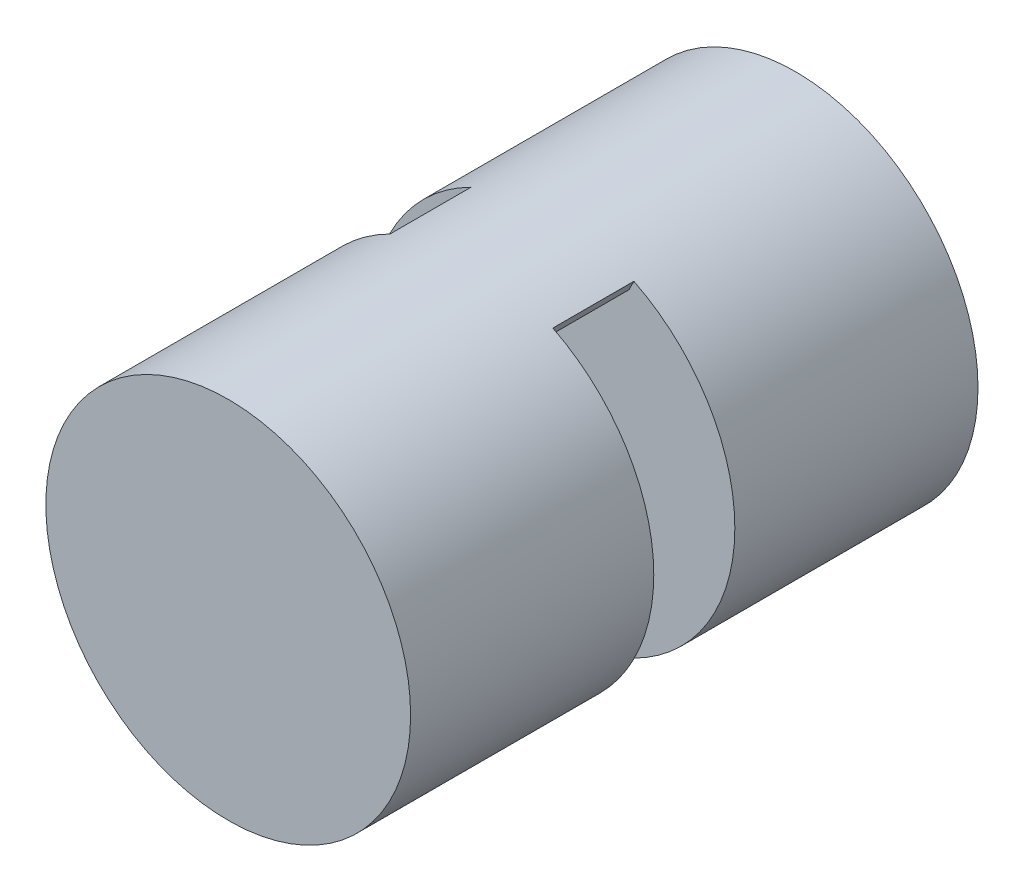
ISO-10303-21;
HEADER;
FILE_DESCRIPTION(('STEP AP214'),'2;1');
FILE_NAME('part.step','',(''),(''),'','','');
FILE_SCHEMA(('AUTOMOTIVE_DESIGN { 1 0 10303 214 1 1 1 1 }'));
ENDSEC;
DATA;
#1=APPLICATION_CONTEXT('core data for automotive mechanical design processes');
#2=APPLICATION_PROTOCOL_DEFINITION('international standard','automotive_design',2000,#1);
#3=PRODUCT_CONTEXT('',#1,'mechanical');
#4=PRODUCT('Part','Part','',(#3));
#5=PRODUCT_RELATED_PRODUCT_CATEGORY('part','',(#4));
#6=PRODUCT_DEFINITION_FORMATION('','',#4);
#7=PRODUCT_DEFINITION_CONTEXT('part definition',#1,'design');
#8=PRODUCT_DEFINITION('design','',#6,#7);
#9=PRODUCT_DEFINITION_SHAPE('','',#8);
#10=(LENGTH_UNIT() NAMED_UNIT(*) SI_UNIT(.MILLI.,.METRE.));
#11=(NAMED_UNIT(*) PLANE_ANGLE_UNIT() SI_UNIT($,.RADIAN.));
#12=(NAMED_UNIT(*) SI_UNIT($,.STERADIAN.) SOLID_ANGLE_UNIT());
#13=UNCERTAINTY_MEASURE_WITH_UNIT(LENGTH_MEASURE(1.E-05),#10,'distance_accuracy_value','');
#14=(GEOMETRIC_REPRESENTATION_CONTEXT(3) GLOBAL_UNCERTAINTY_ASSIGNED_CONTEXT((#13)) GLOBAL_UNIT_ASSIGNED_CONTEXT((#10,
#11,#12)) REPRESENTATION_CONTEXT('',''));
#15=CARTESIAN_POINT('',(0.,0.,0.));
#16=DIRECTION('',(0.,0.,1.));
#17=DIRECTION('',(1.,0.,0.));
#18=AXIS2_PLACEMENT_3D('',#15,#16,#17);
#19=CARTESIAN_POINT('',(0.,0.,30.));
#20=DIRECTION('',(0.,0.,1.));
#21=DIRECTION('',(1.,0.,0.));
#22=AXIS2_PLACEMENT_3D('',#19,#20,#21);
#23=PLANE('',#22);
#24=CARTESIAN_POINT('',(0.,0.,30.));
#25=DIRECTION('',(0.,0.,-1.));
#26=DIRECTION('',(1.,0.,0.));
#27=AXIS2_PLACEMENT_3D('',#24,#25,#26);
#28=CIRCLE('',#27,21.1536416609865);
#29=CARTESIAN_POINT('',(9.44725249039118,-18.9268585852016,30.));
#30=VERTEX_POINT('',#29);
#31=CARTESIAN_POINT('',(-9.44725249039115,-18.9268585852016,30.));
#32=VERTEX_POINT('',#31);
#33=EDGE_CURVE('E145',#30,#32,#28,.T.);
#34=ORIENTED_EDGE('',*,*,#33,.F.);
#35=DIRECTION('',(-0.446601707724618,0.894732873352407,0.));
#36=VECTOR('',#35,1.);
#37=CARTESIAN_POINT('',(10.0485384238039,-20.1314896504292,30.));
#38=LINE('',#37,#36);
#39=CARTESIAN_POINT('',(10.0485384238039,-20.1314896504292,30.));
#40=VERTEX_POINT('',#39);
#41=EDGE_CURVE('E132',#40,#30,#38,.T.);
#42=ORIENTED_EDGE('',*,*,#41,.F.);
#43=CARTESIAN_POINT('',(0.,0.,30.));
#44=DIRECTION('',(0.,0.,1.));
#45=DIRECTION('',(1.,0.,0.));
#46=AXIS2_PLACEMENT_3D('',#43,#44,#45);
#47=CIRCLE('',#46,22.5);
#48=CARTESIAN_POINT('',(10.0485384238039,20.1314896504292,30.));
#49=VERTEX_POINT('',#48);
#50=EDGE_CURVE('E47',#40,#49,#47,.T.);
#51=ORIENTED_EDGE('',*,*,#50,.T.);
#52=DIRECTION('',(0.446601707724617,0.894732873352408,0.));
#53=VECTOR('',#52,1.);
#54=CARTESIAN_POINT('',(10.0485384238039,20.1314896504292,30.));
#55=LINE('',#54,#53);
#56=CARTESIAN_POINT('',(9.44725249039119,18.9268585852016,30.));
#57=VERTEX_POINT('',#56);
#58=EDGE_CURVE('E62',#57,#49,#55,.T.);
#59=ORIENTED_EDGE('',*,*,#58,.F.);
#60=CARTESIAN_POINT('',(0.,0.,30.));
#61=DIRECTION('',(0.,0.,-1.));
#62=DIRECTION('',(1.,0.,0.));
#63=AXIS2_PLACEMENT_3D('',#60,#61,#62);
#64=CIRCLE('',#63,21.1536416609865);
#65=CARTESIAN_POINT('',(-9.44725249039119,18.9268585852016,30.));
#66=VERTEX_POINT('',#65);
#67=EDGE_CURVE('E162',#66,#57,#64,.T.);
#68=ORIENTED_EDGE('',*,*,#67,.F.);
#69=DIRECTION('',(0.446601707724618,-0.894732873352407,0.));
#70=VECTOR('',#69,1.);
#71=CARTESIAN_POINT('',(-10.0485384238039,20.1314896504292,30.));
#72=LINE('',#71,#70);
#73=CARTESIAN_POINT('',(-10.0485384238039,20.1314896504292,30.));
#74=VERTEX_POINT('',#73);
#75=EDGE_CURVE('E154',#74,#66,#72,.T.);
#76=ORIENTED_EDGE('',*,*,#75,.F.);
#77=CARTESIAN_POINT('',(-10.0485384238039,-20.1314896504292,30.));
#78=VERTEX_POINT('',#77);
#79=EDGE_CURVE('E12',#74,#78,#47,.T.);
#80=ORIENTED_EDGE('',*,*,#79,.T.);
#81=DIRECTION('',(-0.446601707724617,-0.894732873352408,0.));
#82=VECTOR('',#81,1.);
#83=CARTESIAN_POINT('',(-10.0485384238039,-20.1314896504292,30.));
#84=LINE('',#83,#82);
#85=EDGE_CURVE('E140',#32,#78,#84,.T.);
#86=ORIENTED_EDGE('',*,*,#85,.F.);
#87=EDGE_LOOP('',(#34,#42,#51,#59,#68,#76,#80,#86));
#88=FACE_BOUND('',#87,.T.);
#89=ADVANCED_FACE('F38',(#88),#23,.T.);
#90=CARTESIAN_POINT('',(0.,0.,30.));
#91=DIRECTION('',(0.,0.,-1.));
#92=DIRECTION('',(-1.,0.,0.));
#93=AXIS2_PLACEMENT_3D('',#90,#91,#92);
#94=CYLINDRICAL_SURFACE('',#93,22.5);
#95=DIRECTION('',(0.,0.,-1.));
#96=VECTOR('',#95,1.);
#97=CARTESIAN_POINT('',(-10.0485384238039,20.1314896504292,40.));
#98=LINE('',#97,#96);
#99=CARTESIAN_POINT('',(-10.0485384238039,20.1314896504292,40.));
#100=VERTEX_POINT('',#99);
#101=EDGE_CURVE('E105',#100,#74,#98,.T.);
#102=ORIENTED_EDGE('',*,*,#101,.F.);
#103=CARTESIAN_POINT('',(0.,0.,40.));
#104=DIRECTION('',(0.,0.,1.));
#105=DIRECTION('',(1.,0.,0.));
#106=AXIS2_PLACEMENT_3D('',#103,#104,#105);
#107=CIRCLE('',#106,22.5);
#108=CARTESIAN_POINT('',(-10.0485384238039,-20.1314896504292,40.));
#109=VERTEX_POINT('',#108);
#110=EDGE_CURVE('E110',#100,#109,#107,.T.);
#111=ORIENTED_EDGE('',*,*,#110,.T.);
#112=DIRECTION('',(0.,0.,-1.));
#113=VECTOR('',#112,1.);
#114=CARTESIAN_POINT('',(-10.0485384238039,-20.1314896504292,40.));
#115=LINE('',#114,#113);
#116=EDGE_CURVE('E143',#109,#78,#115,.T.);
#117=ORIENTED_EDGE('',*,*,#116,.T.);
#118=ORIENTED_EDGE('',*,*,#79,.F.);
#119=EDGE_LOOP('',(#102,#111,#117,#118));
#120=FACE_BOUND('',#119,.T.);
#121=CARTESIAN_POINT('',(10.0485384238039,-20.1314896504292,40.));
#122=VERTEX_POINT('',#121);
#123=CARTESIAN_POINT('',(10.0485384238039,20.1314896504292,40.));
#124=VERTEX_POINT('',#123);
#125=EDGE_CURVE('E129',#122,#124,#107,.T.);
#126=ORIENTED_EDGE('',*,*,#125,.T.);
#127=DIRECTION('',(0.,0.,-1.));
#128=VECTOR('',#127,1.);
#129=CARTESIAN_POINT('',(10.0485384238039,20.1314896504292,40.));
#130=LINE('',#129,#128);
#131=EDGE_CURVE('E160',#124,#49,#130,.T.);
#132=ORIENTED_EDGE('',*,*,#131,.T.);
#133=ORIENTED_EDGE('',*,*,#50,.F.);
#134=DIRECTION('',(0.,0.,-1.));
#135=VECTOR('',#134,1.);
#136=CARTESIAN_POINT('',(10.0485384238039,-20.1314896504292,40.));
#137=LINE('',#136,#135);
#138=EDGE_CURVE('E153',#122,#40,#137,.T.);
#139=ORIENTED_EDGE('',*,*,#138,.F.);
#140=EDGE_LOOP('',(#126,#132,#133,#139));
#141=FACE_BOUND('',#140,.T.);
#142=CARTESIAN_POINT('',(0.,0.,0.));
#143=DIRECTION('',(0.,0.,1.));
#144=DIRECTION('',(1.,0.,0.));
#145=AXIS2_PLACEMENT_3D('',#142,#143,#144);
#146=CIRCLE('',#145,22.5);
#147=CARTESIAN_POINT('',(22.5,0.,0.));
#148=VERTEX_POINT('',#147);
#149=EDGE_CURVE('E42',#148,#148,#146,.T.);
#150=ORIENTED_EDGE('',*,*,#149,.T.);
#151=EDGE_LOOP('',(#150));
#152=FACE_BOUND('',#151,.T.);
#153=CARTESIAN_POINT('',(0.,0.,70.));
#154=DIRECTION('',(0.,0.,1.));
#155=DIRECTION('',(1.,0.,0.));
#156=AXIS2_PLACEMENT_3D('',#153,#154,#155);
#157=CIRCLE('',#156,22.5);
#158=CARTESIAN_POINT('',(22.5,0.,70.));
#159=VERTEX_POINT('',#158);
#160=EDGE_CURVE('E128',#159,#159,#157,.T.);
#161=ORIENTED_EDGE('',*,*,#160,.F.);
#162=EDGE_LOOP('',(#161));
#163=FACE_BOUND('',#162,.T.);
#164=ADVANCED_FACE('F40',(#120,#141,#152,#163),#94,.T.);
#165=CARTESIAN_POINT('',(0.,0.,0.));
#166=DIRECTION('',(0.,0.,1.));
#167=DIRECTION('',(1.,0.,0.));
#168=AXIS2_PLACEMENT_3D('',#165,#166,#167);
#169=PLANE('',#168);
#170=ORIENTED_EDGE('',*,*,#149,.F.);
#171=EDGE_LOOP('',(#170));
#172=FACE_BOUND('',#171,.T.);
#173=ADVANCED_FACE('F201',(#172),#169,.F.);
#174=CARTESIAN_POINT('',(-10.0485384238039,20.1314896504292,40.));
#175=DIRECTION('',(0.894732873352408,0.446601707724618,0.));
#176=DIRECTION('',(-0.446601707724618,0.894732873352408,0.));
#177=AXIS2_PLACEMENT_3D('',#174,#175,#176);
#178=PLANE('',#177);
#179=ORIENTED_EDGE('',*,*,#75,.T.);
#180=DIRECTION('',(0.,0.,-1.));
#181=VECTOR('',#180,1.);
#182=CARTESIAN_POINT('',(-9.44725249039119,18.9268585852016,40.));
#183=LINE('',#182,#181);
#184=CARTESIAN_POINT('',(-9.44725249039119,18.9268585852016,40.));
#185=VERTEX_POINT('',#184);
#186=EDGE_CURVE('E113',#185,#66,#183,.T.);
#187=ORIENTED_EDGE('',*,*,#186,.F.);
#188=DIRECTION('',(0.446601707724618,-0.894732873352407,0.));
#189=VECTOR('',#188,1.);
#190=CARTESIAN_POINT('',(-10.0485384238039,20.1314896504292,40.));
#191=LINE('',#190,#189);
#192=EDGE_CURVE('E116',#100,#185,#191,.T.);
#193=ORIENTED_EDGE('',*,*,#192,.F.);
#194=ORIENTED_EDGE('',*,*,#101,.T.);
#195=EDGE_LOOP('',(#179,#187,#193,#194));
#196=FACE_BOUND('',#195,.T.);
#197=ADVANCED_FACE('F117',(#196),#178,.F.);
#198=CARTESIAN_POINT('',(0.,0.,40.));
#199=DIRECTION('',(0.,0.,-1.));
#200=DIRECTION('',(-1.,0.,0.));
#201=AXIS2_PLACEMENT_3D('',#198,#199,#200);
#202=CYLINDRICAL_SURFACE('',#201,21.1536416609865);
#203=ORIENTED_EDGE('',*,*,#67,.T.);
#204=DIRECTION('',(0.,0.,-1.));
#205=VECTOR('',#204,1.);
#206=CARTESIAN_POINT('',(9.44725249039119,18.9268585852016,40.));
#207=LINE('',#206,#205);
#208=CARTESIAN_POINT('',(9.44725249039119,18.9268585852016,40.));
#209=VERTEX_POINT('',#208);
#210=EDGE_CURVE('E167',#209,#57,#207,.T.);
#211=ORIENTED_EDGE('',*,*,#210,.F.);
#212=CARTESIAN_POINT('',(0.,0.,40.));
#213=DIRECTION('',(0.,0.,-1.));
#214=DIRECTION('',(1.,0.,0.));
#215=AXIS2_PLACEMENT_3D('',#212,#213,#214);
#216=CIRCLE('',#215,21.1536416609865);
#217=EDGE_CURVE('E122',#185,#209,#216,.T.);
#218=ORIENTED_EDGE('',*,*,#217,.F.);
#219=ORIENTED_EDGE('',*,*,#186,.T.);
#220=EDGE_LOOP('',(#203,#211,#218,#219));
#221=FACE_BOUND('',#220,.T.);
#222=ADVANCED_FACE('F171',(#221),#202,.F.);
#223=CARTESIAN_POINT('',(10.0485384238039,20.1314896504292,40.));
#224=DIRECTION('',(-0.894732873352408,0.446601707724617,0.));
#225=DIRECTION('',(-0.446601707724617,-0.894732873352408,0.));
#226=AXIS2_PLACEMENT_3D('',#223,#224,#225);
#227=PLANE('',#226);
#228=ORIENTED_EDGE('',*,*,#58,.T.);
#229=ORIENTED_EDGE('',*,*,#131,.F.);
#230=DIRECTION('',(0.446601707724617,0.894732873352408,0.));
#231=VECTOR('',#230,1.);
#232=CARTESIAN_POINT('',(10.0485384238039,20.1314896504292,40.));
#233=LINE('',#232,#231);
#234=EDGE_CURVE('E157',#209,#124,#233,.T.);
#235=ORIENTED_EDGE('',*,*,#234,.F.);
#236=ORIENTED_EDGE('',*,*,#210,.T.);
#237=EDGE_LOOP('',(#228,#229,#235,#236));
#238=FACE_BOUND('',#237,.T.);
#239=ADVANCED_FACE('F187',(#238),#227,.F.);
#240=CARTESIAN_POINT('',(10.0485384238039,-20.1314896504292,40.));
#241=DIRECTION('',(-0.894732873352408,-0.446601707724618,0.));
#242=DIRECTION('',(0.446601707724618,-0.894732873352408,0.));
#243=AXIS2_PLACEMENT_3D('',#240,#241,#242);
#244=PLANE('',#243);
#245=ORIENTED_EDGE('',*,*,#41,.T.);
#246=DIRECTION('',(0.,0.,-1.));
#247=VECTOR('',#246,1.);
#248=CARTESIAN_POINT('',(9.44725249039118,-18.9268585852016,40.));
#249=LINE('',#248,#247);
#250=CARTESIAN_POINT('',(9.44725249039118,-18.9268585852016,40.));
#251=VERTEX_POINT('',#250);
#252=EDGE_CURVE('E150',#251,#30,#249,.T.);
#253=ORIENTED_EDGE('',*,*,#252,.F.);
#254=DIRECTION('',(-0.446601707724618,0.894732873352407,0.));
#255=VECTOR('',#254,1.);
#256=CARTESIAN_POINT('',(10.0485384238039,-20.1314896504292,40.));
#257=LINE('',#256,#255);
#258=EDGE_CURVE('E136',#122,#251,#257,.T.);
#259=ORIENTED_EDGE('',*,*,#258,.F.);
#260=ORIENTED_EDGE('',*,*,#138,.T.);
#261=EDGE_LOOP('',(#245,#253,#259,#260));
#262=FACE_BOUND('',#261,.T.);
#263=ADVANCED_FACE('F180',(#262),#244,.F.);
#264=CARTESIAN_POINT('',(0.,0.,40.));
#265=DIRECTION('',(0.,0.,-1.));
#266=DIRECTION('',(-1.,0.,0.));
#267=AXIS2_PLACEMENT_3D('',#264,#265,#266);
#268=CYLINDRICAL_SURFACE('',#267,21.1536416609865);
#269=ORIENTED_EDGE('',*,*,#33,.T.);
#270=DIRECTION('',(0.,0.,-1.));
#271=VECTOR('',#270,1.);
#272=CARTESIAN_POINT('',(-9.44725249039119,-18.9268585852016,40.));
#273=LINE('',#272,#271);
#274=CARTESIAN_POINT('',(-9.44725249039119,-18.9268585852016,40.));
#275=VERTEX_POINT('',#274);
#276=EDGE_CURVE('E54',#275,#32,#273,.T.);
#277=ORIENTED_EDGE('',*,*,#276,.F.);
#278=CARTESIAN_POINT('',(0.,0.,40.));
#279=DIRECTION('',(0.,0.,-1.));
#280=DIRECTION('',(1.,0.,0.));
#281=AXIS2_PLACEMENT_3D('',#278,#279,#280);
#282=CIRCLE('',#281,21.1536416609865);
#283=EDGE_CURVE('E139',#251,#275,#282,.T.);
#284=ORIENTED_EDGE('',*,*,#283,.F.);
#285=ORIENTED_EDGE('',*,*,#252,.T.);
#286=EDGE_LOOP('',(#269,#277,#284,#285));
#287=FACE_BOUND('',#286,.T.);
#288=ADVANCED_FACE('F183',(#287),#268,.F.);
#289=CARTESIAN_POINT('',(-10.0485384238039,-20.1314896504292,40.));
#290=DIRECTION('',(0.894732873352408,-0.446601707724617,0.));
#291=DIRECTION('',(0.446601707724617,0.894732873352408,0.));
#292=AXIS2_PLACEMENT_3D('',#289,#290,#291);
#293=PLANE('',#292);
#294=ORIENTED_EDGE('',*,*,#85,.T.);
#295=ORIENTED_EDGE('',*,*,#116,.F.);
#296=DIRECTION('',(-0.446601707724617,-0.894732873352408,0.));
#297=VECTOR('',#296,1.);
#298=CARTESIAN_POINT('',(-10.0485384238039,-20.1314896504292,40.));
#299=LINE('',#298,#297);
#300=EDGE_CURVE('E127',#275,#109,#299,.T.);
#301=ORIENTED_EDGE('',*,*,#300,.F.);
#302=ORIENTED_EDGE('',*,*,#276,.T.);
#303=EDGE_LOOP('',(#294,#295,#301,#302));
#304=FACE_BOUND('',#303,.T.);
#305=ADVANCED_FACE('F186',(#304),#293,.F.);
#306=CARTESIAN_POINT('',(0.,0.,40.));
#307=DIRECTION('',(0.,0.,1.));
#308=DIRECTION('',(1.,0.,0.));
#309=AXIS2_PLACEMENT_3D('',#306,#307,#308);
#310=PLANE('',#309);
#311=ORIENTED_EDGE('',*,*,#110,.F.);
#312=ORIENTED_EDGE('',*,*,#192,.T.);
#313=ORIENTED_EDGE('',*,*,#217,.T.);
#314=ORIENTED_EDGE('',*,*,#234,.T.);
#315=ORIENTED_EDGE('',*,*,#125,.F.);
#316=ORIENTED_EDGE('',*,*,#258,.T.);
#317=ORIENTED_EDGE('',*,*,#283,.T.);
#318=ORIENTED_EDGE('',*,*,#300,.T.);
#319=EDGE_LOOP('',(#311,#312,#313,#314,#315,#316,#317,#318));
#320=FACE_BOUND('',#319,.T.);
#321=ADVANCED_FACE('F125',(#320),#310,.F.);
#322=CARTESIAN_POINT('',(0.,0.,70.));
#323=DIRECTION('',(0.,0.,1.));
#324=DIRECTION('',(1.,0.,0.));
#325=AXIS2_PLACEMENT_3D('',#322,#323,#324);
#326=PLANE('',#325);
#327=ORIENTED_EDGE('',*,*,#160,.T.);
#328=EDGE_LOOP('',(#327));
#329=FACE_BOUND('',#328,.T.);
#330=ADVANCED_FACE('F213',(#329),#326,.T.);
#331=CLOSED_SHELL('',(#89,#164,#173,#197,#222,#239,#263,#288,#305,#321,#330));
#332=MANIFOLD_SOLID_BREP('B2',#331);
#333=ADVANCED_BREP_SHAPE_REPRESENTATION('',(#18,#332),#14);
#334=SHAPE_DEFINITION_REPRESENTATION(#9,#333);
ENDSEC;
END-ISO-10303-21;
